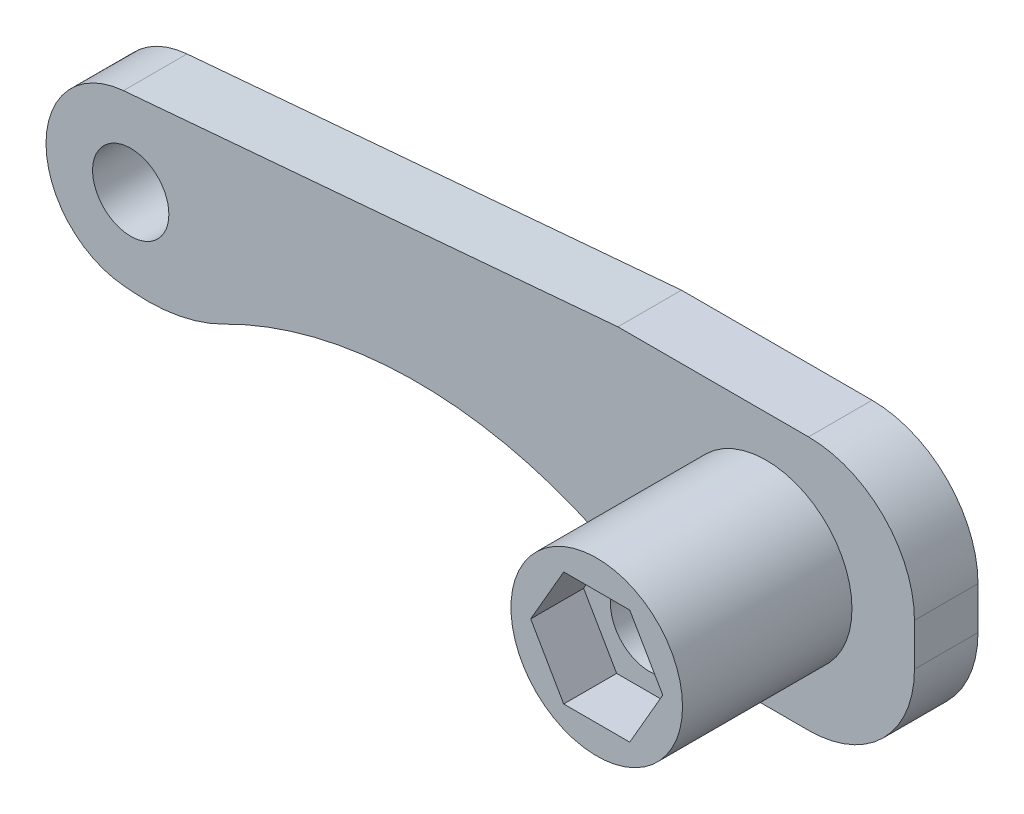
ISO-10303-21;
HEADER;
FILE_DESCRIPTION(('STEP AP214'),'2;1');
FILE_NAME('part.step','',(''),(''),'','','');
FILE_SCHEMA(('AUTOMOTIVE_DESIGN { 1 0 10303 214 1 1 1 1 }'));
ENDSEC;
DATA;
#1=APPLICATION_CONTEXT('core data for automotive mechanical design processes');
#2=APPLICATION_PROTOCOL_DEFINITION('international standard','automotive_design',2000,#1);
#3=PRODUCT_CONTEXT('',#1,'mechanical');
#4=PRODUCT('Part','Part','',(#3));
#5=PRODUCT_RELATED_PRODUCT_CATEGORY('part','',(#4));
#6=PRODUCT_DEFINITION_FORMATION('','',#4);
#7=PRODUCT_DEFINITION_CONTEXT('part definition',#1,'design');
#8=PRODUCT_DEFINITION('design','',#6,#7);
#9=PRODUCT_DEFINITION_SHAPE('','',#8);
#10=(LENGTH_UNIT() NAMED_UNIT(*) SI_UNIT(.MILLI.,.METRE.));
#11=(NAMED_UNIT(*) PLANE_ANGLE_UNIT() SI_UNIT($,.RADIAN.));
#12=(NAMED_UNIT(*) SI_UNIT($,.STERADIAN.) SOLID_ANGLE_UNIT());
#13=UNCERTAINTY_MEASURE_WITH_UNIT(LENGTH_MEASURE(1.E-05),#10,'distance_accuracy_value','');
#14=(GEOMETRIC_REPRESENTATION_CONTEXT(3) GLOBAL_UNCERTAINTY_ASSIGNED_CONTEXT((#13)) GLOBAL_UNIT_ASSIGNED_CONTEXT((#10,
#11,#12)) REPRESENTATION_CONTEXT('',''));
#15=CARTESIAN_POINT('',(0.,0.,0.));
#16=DIRECTION('',(0.,0.,1.));
#17=DIRECTION('',(1.,0.,0.));
#18=AXIS2_PLACEMENT_3D('',#15,#16,#17);
#19=CARTESIAN_POINT('',(0.,-6.,3.));
#20=DIRECTION('',(0.,1.,0.));
#21=DIRECTION('',(0.,0.,1.));
#22=AXIS2_PLACEMENT_3D('',#19,#20,#21);
#23=PLANE('',#22);
#24=DIRECTION('',(1.,0.,0.));
#25=VECTOR('',#24,1.);
#26=CARTESIAN_POINT('',(0.,-6.,3.));
#27=LINE('',#26,#25);
#28=CARTESIAN_POINT('',(-0.531280577328697,-6.,3.));
#29=VERTEX_POINT('',#28);
#30=CARTESIAN_POINT('',(2.,-6.,3.));
#31=VERTEX_POINT('',#30);
#32=EDGE_CURVE('E233',#29,#31,#27,.T.);
#33=ORIENTED_EDGE('',*,*,#32,.F.);
#34=DIRECTION('',(0.,0.,-1.));
#35=VECTOR('',#34,1.);
#36=CARTESIAN_POINT('',(-0.531280577328697,-6.,0.));
#37=LINE('',#36,#35);
#38=CARTESIAN_POINT('',(-0.531280577328697,-6.,0.));
#39=VERTEX_POINT('',#38);
#40=EDGE_CURVE('E62',#29,#39,#37,.T.);
#41=ORIENTED_EDGE('',*,*,#40,.T.);
#42=DIRECTION('',(1.,0.,0.));
#43=VECTOR('',#42,1.);
#44=CARTESIAN_POINT('',(0.,-6.,0.));
#45=LINE('',#44,#43);
#46=CARTESIAN_POINT('',(2.,-6.,0.));
#47=VERTEX_POINT('',#46);
#48=EDGE_CURVE('E229',#39,#47,#45,.T.);
#49=ORIENTED_EDGE('',*,*,#48,.T.);
#50=DIRECTION('',(0.,0.,-1.));
#51=VECTOR('',#50,1.);
#52=CARTESIAN_POINT('',(2.,-6.,3.));
#53=LINE('',#52,#51);
#54=EDGE_CURVE('E286',#47,#31,#53,.F.);
#55=ORIENTED_EDGE('',*,*,#54,.T.);
#56=EDGE_LOOP('',(#33,#41,#49,#55));
#57=FACE_BOUND('',#56,.T.);
#58=ADVANCED_FACE('F39',(#57),#23,.F.);
#59=CARTESIAN_POINT('',(-0.565790740129366,-6.55533627372847,3.));
#60=DIRECTION('',(-0.0859902551616277,-0.996295978119574,0.));
#61=DIRECTION('',(0.996295978119574,-0.0859902551616277,0.));
#62=AXIS2_PLACEMENT_3D('',#59,#60,#61);
#63=PLANE('',#62);
#64=DIRECTION('',(-0.996295978119574,0.0859902551616277,0.));
#65=VECTOR('',#64,1.);
#66=CARTESIAN_POINT('',(-0.565790740129366,-6.55533627372847,0.));
#67=LINE('',#66,#65);
#68=CARTESIAN_POINT('',(-29.901916014926,-4.02333679442265,0.));
#69=VERTEX_POINT('',#68);
#70=CARTESIAN_POINT('',(-30.3439610206465,-3.9851839124783,0.));
#71=VERTEX_POINT('',#70);
#72=EDGE_CURVE('E265',#69,#71,#67,.T.);
#73=ORIENTED_EDGE('',*,*,#72,.F.);
#74=DIRECTION('',(0.,0.,1.));
#75=VECTOR('',#74,1.);
#76=CARTESIAN_POINT('',(-29.901916014926,-4.02333679442265,3.));
#77=LINE('',#76,#75);
#78=CARTESIAN_POINT('',(-29.901916014926,-4.02333679442265,3.));
#79=VERTEX_POINT('',#78);
#80=EDGE_CURVE('E11',#69,#79,#77,.T.);
#81=ORIENTED_EDGE('',*,*,#80,.T.);
#82=DIRECTION('',(-0.996295978119574,0.0859902551616277,0.));
#83=VECTOR('',#82,1.);
#84=CARTESIAN_POINT('',(-0.565790740129366,-6.55533627372847,3.));
#85=LINE('',#84,#83);
#86=CARTESIAN_POINT('',(-30.3439610206465,-3.9851839124783,3.));
#87=VERTEX_POINT('',#86);
#88=EDGE_CURVE('E247',#79,#87,#85,.T.);
#89=ORIENTED_EDGE('',*,*,#88,.T.);
#90=DIRECTION('',(0.,0.,-1.));
#91=VECTOR('',#90,1.);
#92=CARTESIAN_POINT('',(-30.3439610206465,-3.9851839124783,3.));
#93=LINE('',#92,#91);
#94=EDGE_CURVE('E252',#87,#71,#93,.T.);
#95=ORIENTED_EDGE('',*,*,#94,.T.);
#96=EDGE_LOOP('',(#73,#81,#89,#95));
#97=FACE_BOUND('',#96,.T.);
#98=ADVANCED_FACE('F352',(#97),#63,.T.);
#99=CARTESIAN_POINT('',(0.,0.,3.));
#100=DIRECTION('',(0.,0.,1.));
#101=DIRECTION('',(1.,0.,0.));
#102=AXIS2_PLACEMENT_3D('',#99,#100,#101);
#103=PLANE('',#102);
#104=CARTESIAN_POINT('',(0.,0.,3.));
#105=DIRECTION('',(0.,0.,1.));
#106=DIRECTION('',(1.,0.,0.));
#107=AXIS2_PLACEMENT_3D('',#104,#105,#106);
#108=CIRCLE('',#107,4.05);
#109=CARTESIAN_POINT('',(4.05,0.,3.));
#110=VERTEX_POINT('',#109);
#111=EDGE_CURVE('E230',#110,#110,#108,.T.);
#112=ORIENTED_EDGE('',*,*,#111,.F.);
#113=EDGE_LOOP('',(#112));
#114=FACE_BOUND('',#113,.T.);
#115=CARTESIAN_POINT('',(-30.,0.,3.));
#116=DIRECTION('',(0.,0.,1.));
#117=DIRECTION('',(1.,0.,0.));
#118=AXIS2_PLACEMENT_3D('',#115,#116,#117);
#119=CIRCLE('',#118,1.8);
#120=CARTESIAN_POINT('',(-28.2,0.,3.));
#121=VERTEX_POINT('',#120);
#122=EDGE_CURVE('E249',#121,#121,#119,.T.);
#123=ORIENTED_EDGE('',*,*,#122,.F.);
#124=EDGE_LOOP('',(#123));
#125=FACE_BOUND('',#124,.T.);
#126=CARTESIAN_POINT('',(-16.5,-21.,3.));
#127=DIRECTION('',(0.,0.,1.));
#128=DIRECTION('',(1.,0.,0.));
#129=AXIS2_PLACEMENT_3D('',#126,#127,#128);
#130=CIRCLE('',#129,20.);
#131=CARTESIAN_POINT('',(-25.5814242668807,-3.18069212104719,3.));
#132=VERTEX_POINT('',#131);
#133=CARTESIAN_POINT('',(-5.09377184094907,-4.57142857142857,3.));
#134=VERTEX_POINT('',#133);
#135=EDGE_CURVE('E192',#132,#134,#130,.F.);
#136=ORIENTED_EDGE('',*,*,#135,.T.);
#137=CARTESIAN_POINT('',(-0.531280577328697,2.,3.));
#138=DIRECTION('',(0.,0.,1.));
#139=DIRECTION('',(1.,0.,0.));
#140=AXIS2_PLACEMENT_3D('',#137,#138,#139);
#141=CIRCLE('',#140,8.);
#142=EDGE_CURVE('E305',#134,#29,#141,.T.);
#143=ORIENTED_EDGE('',*,*,#142,.T.);
#144=ORIENTED_EDGE('',*,*,#32,.T.);
#145=CARTESIAN_POINT('',(2.,-0.999999999999999,3.));
#146=DIRECTION('',(0.,0.,1.));
#147=DIRECTION('',(1.,0.,0.));
#148=AXIS2_PLACEMENT_3D('',#145,#146,#147);
#149=CIRCLE('',#148,5.);
#150=CARTESIAN_POINT('',(7.,-0.999999999999999,3.));
#151=VERTEX_POINT('',#150);
#152=EDGE_CURVE('E291',#31,#151,#149,.T.);
#153=ORIENTED_EDGE('',*,*,#152,.T.);
#154=DIRECTION('',(0.,1.,0.));
#155=VECTOR('',#154,1.);
#156=CARTESIAN_POINT('',(7.,0.,3.));
#157=LINE('',#156,#155);
#158=CARTESIAN_POINT('',(7.,1.,3.));
#159=VERTEX_POINT('',#158);
#160=EDGE_CURVE('E236',#151,#159,#157,.T.);
#161=ORIENTED_EDGE('',*,*,#160,.T.);
#162=CARTESIAN_POINT('',(2.,1.,3.));
#163=DIRECTION('',(0.,0.,1.));
#164=DIRECTION('',(1.,0.,0.));
#165=AXIS2_PLACEMENT_3D('',#162,#163,#164);
#166=CIRCLE('',#165,5.);
#167=CARTESIAN_POINT('',(2.,6.,3.));
#168=VERTEX_POINT('',#167);
#169=EDGE_CURVE('E289',#159,#168,#166,.T.);
#170=ORIENTED_EDGE('',*,*,#169,.T.);
#171=DIRECTION('',(1.,0.,0.));
#172=VECTOR('',#171,1.);
#173=CARTESIAN_POINT('',(0.,6.,3.));
#174=LINE('',#173,#172);
#175=CARTESIAN_POINT('',(-7.,6.,3.));
#176=VERTEX_POINT('',#175);
#177=EDGE_CURVE('E239',#176,#168,#174,.T.);
#178=ORIENTED_EDGE('',*,*,#177,.F.);
#179=DIRECTION('',(-0.996295978119574,-0.0859902551616282,0.));
#180=VECTOR('',#179,1.);
#181=CARTESIAN_POINT('',(-0.56579074012937,6.55533627372847,3.));
#182=LINE('',#181,#180);
#183=CARTESIAN_POINT('',(-30.3439610206465,3.98518391247829,3.));
#184=VERTEX_POINT('',#183);
#185=EDGE_CURVE('E242',#176,#184,#182,.T.);
#186=ORIENTED_EDGE('',*,*,#185,.T.);
#187=CARTESIAN_POINT('',(-30.,0.,3.));
#188=DIRECTION('',(0.,0.,1.));
#189=DIRECTION('',(1.,0.,0.));
#190=AXIS2_PLACEMENT_3D('',#187,#188,#189);
#191=CIRCLE('',#190,4.);
#192=EDGE_CURVE('E244',#184,#87,#191,.T.);
#193=ORIENTED_EDGE('',*,*,#192,.T.);
#194=ORIENTED_EDGE('',*,*,#88,.F.);
#195=CARTESIAN_POINT('',(-29.213993973633,3.94703103053393,3.));
#196=DIRECTION('',(0.,0.,1.));
#197=DIRECTION('',(1.,0.,0.));
#198=AXIS2_PLACEMENT_3D('',#195,#196,#197);
#199=CIRCLE('',#198,8.);
#200=EDGE_CURVE('E303',#79,#132,#199,.T.);
#201=ORIENTED_EDGE('',*,*,#200,.T.);
#202=EDGE_LOOP('',(#136,#143,#144,#153,#161,#170,#178,#186,#193,#194,#201));
#203=FACE_BOUND('',#202,.T.);
#204=ADVANCED_FACE('F321',(#114,#125,#203),#103,.T.);
#205=CARTESIAN_POINT('',(0.,0.,0.));
#206=DIRECTION('',(0.,0.,1.));
#207=DIRECTION('',(1.,0.,0.));
#208=AXIS2_PLACEMENT_3D('',#205,#206,#207);
#209=PLANE('',#208);
#210=CARTESIAN_POINT('',(-30.,0.,0.));
#211=DIRECTION('',(0.,0.,1.));
#212=DIRECTION('',(1.,0.,0.));
#213=AXIS2_PLACEMENT_3D('',#210,#211,#212);
#214=CIRCLE('',#213,1.8);
#215=CARTESIAN_POINT('',(-28.2,0.,0.));
#216=VERTEX_POINT('',#215);
#217=EDGE_CURVE('E234',#216,#216,#214,.T.);
#218=ORIENTED_EDGE('',*,*,#217,.T.);
#219=EDGE_LOOP('',(#218));
#220=FACE_BOUND('',#219,.T.);
#221=CARTESIAN_POINT('',(0.,0.,0.));
#222=DIRECTION('',(0.,0.,-1.));
#223=DIRECTION('',(-1.,0.,0.));
#224=AXIS2_PLACEMENT_3D('',#221,#222,#223);
#225=CIRCLE('',#224,1.85);
#226=CARTESIAN_POINT('',(-1.85,0.,0.));
#227=VERTEX_POINT('',#226);
#228=EDGE_CURVE('E223',#227,#227,#225,.T.);
#229=ORIENTED_EDGE('',*,*,#228,.F.);
#230=EDGE_LOOP('',(#229));
#231=FACE_BOUND('',#230,.T.);
#232=ORIENTED_EDGE('',*,*,#48,.F.);
#233=CARTESIAN_POINT('',(-0.531280577328697,2.,0.));
#234=DIRECTION('',(0.,0.,1.));
#235=DIRECTION('',(1.,0.,0.));
#236=AXIS2_PLACEMENT_3D('',#233,#234,#235);
#237=CIRCLE('',#236,8.);
#238=CARTESIAN_POINT('',(-5.09377184094907,-4.57142857142857,0.));
#239=VERTEX_POINT('',#238);
#240=EDGE_CURVE('E47',#39,#239,#237,.F.);
#241=ORIENTED_EDGE('',*,*,#240,.T.);
#242=CARTESIAN_POINT('',(-16.5,-21.,0.));
#243=DIRECTION('',(0.,0.,1.));
#244=DIRECTION('',(1.,0.,0.));
#245=AXIS2_PLACEMENT_3D('',#242,#243,#244);
#246=CIRCLE('',#245,20.);
#247=CARTESIAN_POINT('',(-25.5814242668807,-3.18069212104719,0.));
#248=VERTEX_POINT('',#247);
#249=EDGE_CURVE('E311',#248,#239,#246,.F.);
#250=ORIENTED_EDGE('',*,*,#249,.F.);
#251=CARTESIAN_POINT('',(-29.213993973633,3.94703103053393,0.));
#252=DIRECTION('',(0.,0.,1.));
#253=DIRECTION('',(1.,0.,0.));
#254=AXIS2_PLACEMENT_3D('',#251,#252,#253);
#255=CIRCLE('',#254,8.);
#256=EDGE_CURVE('E54',#248,#69,#255,.F.);
#257=ORIENTED_EDGE('',*,*,#256,.T.);
#258=ORIENTED_EDGE('',*,*,#72,.T.);
#259=CARTESIAN_POINT('',(-30.,0.,0.));
#260=DIRECTION('',(0.,0.,1.));
#261=DIRECTION('',(1.,0.,0.));
#262=AXIS2_PLACEMENT_3D('',#259,#260,#261);
#263=CIRCLE('',#262,4.);
#264=CARTESIAN_POINT('',(-30.3439610206465,3.98518391247829,0.));
#265=VERTEX_POINT('',#264);
#266=EDGE_CURVE('E262',#265,#71,#263,.T.);
#267=ORIENTED_EDGE('',*,*,#266,.F.);
#268=DIRECTION('',(-0.996295978119574,-0.0859902551616282,0.));
#269=VECTOR('',#268,1.);
#270=CARTESIAN_POINT('',(-0.56579074012937,6.55533627372847,0.));
#271=LINE('',#270,#269);
#272=CARTESIAN_POINT('',(-7.,6.,0.));
#273=VERTEX_POINT('',#272);
#274=EDGE_CURVE('E260',#273,#265,#271,.T.);
#275=ORIENTED_EDGE('',*,*,#274,.F.);
#276=DIRECTION('',(1.,0.,0.));
#277=VECTOR('',#276,1.);
#278=CARTESIAN_POINT('',(0.,6.,0.));
#279=LINE('',#278,#277);
#280=CARTESIAN_POINT('',(2.,6.,0.));
#281=VERTEX_POINT('',#280);
#282=EDGE_CURVE('E257',#273,#281,#279,.T.);
#283=ORIENTED_EDGE('',*,*,#282,.T.);
#284=CARTESIAN_POINT('',(2.,1.,0.));
#285=DIRECTION('',(0.,0.,1.));
#286=DIRECTION('',(1.,0.,0.));
#287=AXIS2_PLACEMENT_3D('',#284,#285,#286);
#288=CIRCLE('',#287,5.);
#289=CARTESIAN_POINT('',(7.,1.,0.));
#290=VERTEX_POINT('',#289);
#291=EDGE_CURVE('E281',#281,#290,#288,.F.);
#292=ORIENTED_EDGE('',*,*,#291,.T.);
#293=DIRECTION('',(0.,1.,0.));
#294=VECTOR('',#293,1.);
#295=CARTESIAN_POINT('',(7.,0.,0.));
#296=LINE('',#295,#294);
#297=CARTESIAN_POINT('',(7.,-0.999999999999999,0.));
#298=VERTEX_POINT('',#297);
#299=EDGE_CURVE('E254',#298,#290,#296,.T.);
#300=ORIENTED_EDGE('',*,*,#299,.F.);
#301=CARTESIAN_POINT('',(2.,-0.999999999999999,0.));
#302=DIRECTION('',(0.,0.,1.));
#303=DIRECTION('',(1.,0.,0.));
#304=AXIS2_PLACEMENT_3D('',#301,#302,#303);
#305=CIRCLE('',#304,5.);
#306=EDGE_CURVE('E283',#298,#47,#305,.F.);
#307=ORIENTED_EDGE('',*,*,#306,.T.);
#308=EDGE_LOOP('',(#232,#241,#250,#257,#258,#267,#275,#283,#292,#300,#307));
#309=FACE_BOUND('',#308,.T.);
#310=ADVANCED_FACE('F310',(#220,#231,#309),#209,.F.);
#311=CARTESIAN_POINT('',(0.,0.,11.));
#312=DIRECTION('',(0.,0.,-1.));
#313=DIRECTION('',(-1.,0.,0.));
#314=AXIS2_PLACEMENT_3D('',#311,#312,#313);
#315=CYLINDRICAL_SURFACE('',#314,1.85);
#316=ORIENTED_EDGE('',*,*,#228,.T.);
#317=EDGE_LOOP('',(#316));
#318=FACE_BOUND('',#317,.T.);
#319=CARTESIAN_POINT('',(0.,0.,8.5));
#320=DIRECTION('',(0.,0.,1.));
#321=DIRECTION('',(1.,0.,0.));
#322=AXIS2_PLACEMENT_3D('',#319,#320,#321);
#323=CIRCLE('',#322,1.85);
#324=CARTESIAN_POINT('',(1.85,0.,8.5));
#325=VERTEX_POINT('',#324);
#326=EDGE_CURVE('E215',#325,#325,#323,.F.);
#327=ORIENTED_EDGE('',*,*,#326,.F.);
#328=EDGE_LOOP('',(#327));
#329=FACE_BOUND('',#328,.T.);
#330=ADVANCED_FACE('F402',(#318,#329),#315,.F.);
#331=CARTESIAN_POINT('',(7.,0.,3.));
#332=DIRECTION('',(-1.,0.,0.));
#333=DIRECTION('',(0.,0.,1.));
#334=AXIS2_PLACEMENT_3D('',#331,#332,#333);
#335=PLANE('',#334);
#336=ORIENTED_EDGE('',*,*,#160,.F.);
#337=DIRECTION('',(0.,0.,-1.));
#338=VECTOR('',#337,1.);
#339=CARTESIAN_POINT('',(7.,-0.999999999999999,3.));
#340=LINE('',#339,#338);
#341=EDGE_CURVE('E278',#151,#298,#340,.T.);
#342=ORIENTED_EDGE('',*,*,#341,.T.);
#343=ORIENTED_EDGE('',*,*,#299,.T.);
#344=DIRECTION('',(0.,0.,-1.));
#345=VECTOR('',#344,1.);
#346=CARTESIAN_POINT('',(7.,1.,3.));
#347=LINE('',#346,#345);
#348=EDGE_CURVE('E276',#290,#159,#347,.F.);
#349=ORIENTED_EDGE('',*,*,#348,.T.);
#350=EDGE_LOOP('',(#336,#342,#343,#349));
#351=FACE_BOUND('',#350,.T.);
#352=ADVANCED_FACE('F330',(#351),#335,.F.);
#353=CARTESIAN_POINT('',(0.,6.,3.));
#354=DIRECTION('',(0.,1.,0.));
#355=DIRECTION('',(0.,0.,1.));
#356=AXIS2_PLACEMENT_3D('',#353,#354,#355);
#357=PLANE('',#356);
#358=ORIENTED_EDGE('',*,*,#177,.T.);
#359=DIRECTION('',(0.,0.,-1.));
#360=VECTOR('',#359,1.);
#361=CARTESIAN_POINT('',(2.,6.,0.));
#362=LINE('',#361,#360);
#363=EDGE_CURVE('E293',#168,#281,#362,.T.);
#364=ORIENTED_EDGE('',*,*,#363,.T.);
#365=ORIENTED_EDGE('',*,*,#282,.F.);
#366=DIRECTION('',(0.,0.,-1.));
#367=VECTOR('',#366,1.);
#368=CARTESIAN_POINT('',(-7.,6.,3.));
#369=LINE('',#368,#367);
#370=EDGE_CURVE('E274',#176,#273,#369,.T.);
#371=ORIENTED_EDGE('',*,*,#370,.F.);
#372=EDGE_LOOP('',(#358,#364,#365,#371));
#373=FACE_BOUND('',#372,.T.);
#374=ADVANCED_FACE('F338',(#373),#357,.T.);
#375=CARTESIAN_POINT('',(-0.56579074012937,6.55533627372847,3.));
#376=DIRECTION('',(0.0859902551616282,-0.996295978119574,0.));
#377=DIRECTION('',(0.996295978119574,0.0859902551616282,0.));
#378=AXIS2_PLACEMENT_3D('',#375,#376,#377);
#379=PLANE('',#378);
#380=ORIENTED_EDGE('',*,*,#274,.T.);
#381=DIRECTION('',(0.,0.,-1.));
#382=VECTOR('',#381,1.);
#383=CARTESIAN_POINT('',(-30.3439610206465,3.98518391247829,3.));
#384=LINE('',#383,#382);
#385=EDGE_CURVE('E271',#184,#265,#384,.T.);
#386=ORIENTED_EDGE('',*,*,#385,.F.);
#387=ORIENTED_EDGE('',*,*,#185,.F.);
#388=ORIENTED_EDGE('',*,*,#370,.T.);
#389=EDGE_LOOP('',(#380,#386,#387,#388));
#390=FACE_BOUND('',#389,.T.);
#391=ADVANCED_FACE('F344',(#390),#379,.F.);
#392=CARTESIAN_POINT('',(-30.,0.,3.));
#393=DIRECTION('',(0.,0.,-1.));
#394=DIRECTION('',(-1.,0.,0.));
#395=AXIS2_PLACEMENT_3D('',#392,#393,#394);
#396=CYLINDRICAL_SURFACE('',#395,4.);
#397=ORIENTED_EDGE('',*,*,#266,.T.);
#398=ORIENTED_EDGE('',*,*,#94,.F.);
#399=ORIENTED_EDGE('',*,*,#192,.F.);
#400=ORIENTED_EDGE('',*,*,#385,.T.);
#401=EDGE_LOOP('',(#397,#398,#399,#400));
#402=FACE_BOUND('',#401,.T.);
#403=ADVANCED_FACE('F349',(#402),#396,.T.);
#404=CARTESIAN_POINT('',(-30.,0.,3.));
#405=DIRECTION('',(0.,0.,-1.));
#406=DIRECTION('',(-1.,0.,0.));
#407=AXIS2_PLACEMENT_3D('',#404,#405,#406);
#408=CYLINDRICAL_SURFACE('',#407,1.8);
#409=ORIENTED_EDGE('',*,*,#122,.T.);
#410=EDGE_LOOP('',(#409));
#411=FACE_BOUND('',#410,.T.);
#412=ORIENTED_EDGE('',*,*,#217,.F.);
#413=EDGE_LOOP('',(#412));
#414=FACE_BOUND('',#413,.T.);
#415=ADVANCED_FACE('F410',(#411,#414),#408,.F.);
#416=CARTESIAN_POINT('',(0.,0.,11.));
#417=DIRECTION('',(0.,0.,-1.));
#418=DIRECTION('',(-1.,0.,0.));
#419=AXIS2_PLACEMENT_3D('',#416,#417,#418);
#420=CYLINDRICAL_SURFACE('',#419,4.05);
#421=ORIENTED_EDGE('',*,*,#111,.T.);
#422=EDGE_LOOP('',(#421));
#423=FACE_BOUND('',#422,.T.);
#424=CARTESIAN_POINT('',(0.,0.,11.));
#425=DIRECTION('',(0.,0.,1.));
#426=DIRECTION('',(1.,0.,0.));
#427=AXIS2_PLACEMENT_3D('',#424,#425,#426);
#428=CIRCLE('',#427,4.05);
#429=CARTESIAN_POINT('',(4.05,0.,11.));
#430=VERTEX_POINT('',#429);
#431=EDGE_CURVE('E226',#430,#430,#428,.T.);
#432=ORIENTED_EDGE('',*,*,#431,.F.);
#433=EDGE_LOOP('',(#432));
#434=FACE_BOUND('',#433,.T.);
#435=ADVANCED_FACE('F406',(#423,#434),#420,.T.);
#436=CARTESIAN_POINT('',(0.,0.,11.));
#437=DIRECTION('',(0.,0.,1.));
#438=DIRECTION('',(1.,0.,0.));
#439=AXIS2_PLACEMENT_3D('',#436,#437,#438);
#440=PLANE('',#439);
#441=DIRECTION('',(-0.5,0.866025403784439,0.));
#442=VECTOR('',#441,1.);
#443=CARTESIAN_POINT('',(3.11769145362398,0.,11.));
#444=LINE('',#443,#442);
#445=CARTESIAN_POINT('',(3.11769145362398,0.,11.));
#446=VERTEX_POINT('',#445);
#447=CARTESIAN_POINT('',(1.55884572681199,2.7,11.));
#448=VERTEX_POINT('',#447);
#449=EDGE_CURVE('E167',#446,#448,#444,.T.);
#450=ORIENTED_EDGE('',*,*,#449,.F.);
#451=DIRECTION('',(0.5,0.866025403784438,0.));
#452=VECTOR('',#451,1.);
#453=CARTESIAN_POINT('',(1.55884572681199,-2.7,11.));
#454=LINE('',#453,#452);
#455=CARTESIAN_POINT('',(1.55884572681199,-2.7,11.));
#456=VERTEX_POINT('',#455);
#457=EDGE_CURVE('E186',#456,#446,#454,.T.);
#458=ORIENTED_EDGE('',*,*,#457,.F.);
#459=DIRECTION('',(1.,0.,0.));
#460=VECTOR('',#459,1.);
#461=CARTESIAN_POINT('',(-1.55884572681199,-2.7,11.));
#462=LINE('',#461,#460);
#463=CARTESIAN_POINT('',(-1.55884572681199,-2.7,11.));
#464=VERTEX_POINT('',#463);
#465=EDGE_CURVE('E189',#464,#456,#462,.T.);
#466=ORIENTED_EDGE('',*,*,#465,.F.);
#467=DIRECTION('',(0.5,-0.866025403784439,0.));
#468=VECTOR('',#467,1.);
#469=CARTESIAN_POINT('',(-3.11769145362398,0.,11.));
#470=LINE('',#469,#468);
#471=CARTESIAN_POINT('',(-3.11769145362398,0.,11.));
#472=VERTEX_POINT('',#471);
#473=EDGE_CURVE('E208',#472,#464,#470,.T.);
#474=ORIENTED_EDGE('',*,*,#473,.F.);
#475=DIRECTION('',(-0.5,-0.866025403784439,0.));
#476=VECTOR('',#475,1.);
#477=CARTESIAN_POINT('',(-1.55884572681199,2.7,11.));
#478=LINE('',#477,#476);
#479=CARTESIAN_POINT('',(-1.55884572681199,2.7,11.));
#480=VERTEX_POINT('',#479);
#481=EDGE_CURVE('E205',#480,#472,#478,.T.);
#482=ORIENTED_EDGE('',*,*,#481,.F.);
#483=DIRECTION('',(-1.,0.,0.));
#484=VECTOR('',#483,1.);
#485=CARTESIAN_POINT('',(1.55884572681199,2.7,11.));
#486=LINE('',#485,#484);
#487=EDGE_CURVE('E203',#448,#480,#486,.T.);
#488=ORIENTED_EDGE('',*,*,#487,.F.);
#489=EDGE_LOOP('',(#450,#458,#466,#474,#482,#488));
#490=FACE_BOUND('',#489,.T.);
#491=ORIENTED_EDGE('',*,*,#431,.T.);
#492=EDGE_LOOP('',(#491));
#493=FACE_BOUND('',#492,.T.);
#494=ADVANCED_FACE('F371',(#490,#493),#440,.T.);
#495=CARTESIAN_POINT('',(2.,-0.999999999999999,3.));
#496=DIRECTION('',(0.,0.,-1.));
#497=DIRECTION('',(-1.,0.,0.));
#498=AXIS2_PLACEMENT_3D('',#495,#496,#497);
#499=CYLINDRICAL_SURFACE('',#498,5.);
#500=ORIENTED_EDGE('',*,*,#152,.F.);
#501=ORIENTED_EDGE('',*,*,#54,.F.);
#502=ORIENTED_EDGE('',*,*,#306,.F.);
#503=ORIENTED_EDGE('',*,*,#341,.F.);
#504=EDGE_LOOP('',(#500,#501,#502,#503));
#505=FACE_BOUND('',#504,.T.);
#506=ADVANCED_FACE('F326',(#505),#499,.T.);
#507=CARTESIAN_POINT('',(2.,1.,3.));
#508=DIRECTION('',(0.,0.,1.));
#509=DIRECTION('',(1.,0.,0.));
#510=AXIS2_PLACEMENT_3D('',#507,#508,#509);
#511=CYLINDRICAL_SURFACE('',#510,5.);
#512=ORIENTED_EDGE('',*,*,#169,.F.);
#513=ORIENTED_EDGE('',*,*,#348,.F.);
#514=ORIENTED_EDGE('',*,*,#291,.F.);
#515=ORIENTED_EDGE('',*,*,#363,.F.);
#516=EDGE_LOOP('',(#512,#513,#514,#515));
#517=FACE_BOUND('',#516,.T.);
#518=ADVANCED_FACE('F334',(#517),#511,.T.);
#519=CARTESIAN_POINT('',(0.,0.,8.5));
#520=DIRECTION('',(0.,0.,1.));
#521=DIRECTION('',(1.,0.,0.));
#522=AXIS2_PLACEMENT_3D('',#519,#520,#521);
#523=PLANE('',#522);
#524=DIRECTION('',(-0.5,0.866025403784439,0.));
#525=VECTOR('',#524,1.);
#526=CARTESIAN_POINT('',(3.11769145362398,0.,8.5));
#527=LINE('',#526,#525);
#528=CARTESIAN_POINT('',(3.11769145362398,0.,8.5));
#529=VERTEX_POINT('',#528);
#530=CARTESIAN_POINT('',(1.55884572681199,2.7,8.5));
#531=VERTEX_POINT('',#530);
#532=EDGE_CURVE('E164',#529,#531,#527,.T.);
#533=ORIENTED_EDGE('',*,*,#532,.T.);
#534=DIRECTION('',(-1.,0.,0.));
#535=VECTOR('',#534,1.);
#536=CARTESIAN_POINT('',(1.55884572681199,2.7,8.5));
#537=LINE('',#536,#535);
#538=CARTESIAN_POINT('',(-1.55884572681199,2.7,8.5));
#539=VERTEX_POINT('',#538);
#540=EDGE_CURVE('E175',#531,#539,#537,.T.);
#541=ORIENTED_EDGE('',*,*,#540,.T.);
#542=DIRECTION('',(-0.5,-0.866025403784439,0.));
#543=VECTOR('',#542,1.);
#544=CARTESIAN_POINT('',(-1.55884572681199,2.7,8.5));
#545=LINE('',#544,#543);
#546=CARTESIAN_POINT('',(-3.11769145362398,0.,8.5));
#547=VERTEX_POINT('',#546);
#548=EDGE_CURVE('E180',#539,#547,#545,.T.);
#549=ORIENTED_EDGE('',*,*,#548,.T.);
#550=DIRECTION('',(0.5,-0.866025403784439,0.));
#551=VECTOR('',#550,1.);
#552=CARTESIAN_POINT('',(-3.11769145362398,0.,8.5));
#553=LINE('',#552,#551);
#554=CARTESIAN_POINT('',(-1.55884572681199,-2.7,8.5));
#555=VERTEX_POINT('',#554);
#556=EDGE_CURVE('E196',#547,#555,#553,.T.);
#557=ORIENTED_EDGE('',*,*,#556,.T.);
#558=DIRECTION('',(1.,0.,0.));
#559=VECTOR('',#558,1.);
#560=CARTESIAN_POINT('',(-1.55884572681199,-2.7,8.5));
#561=LINE('',#560,#559);
#562=CARTESIAN_POINT('',(1.55884572681199,-2.7,8.5));
#563=VERTEX_POINT('',#562);
#564=EDGE_CURVE('E199',#555,#563,#561,.T.);
#565=ORIENTED_EDGE('',*,*,#564,.T.);
#566=DIRECTION('',(0.5,0.866025403784438,0.));
#567=VECTOR('',#566,1.);
#568=CARTESIAN_POINT('',(1.55884572681199,-2.7,8.5));
#569=LINE('',#568,#567);
#570=EDGE_CURVE('E172',#563,#529,#569,.T.);
#571=ORIENTED_EDGE('',*,*,#570,.T.);
#572=EDGE_LOOP('',(#533,#541,#549,#557,#565,#571));
#573=FACE_BOUND('',#572,.T.);
#574=ORIENTED_EDGE('',*,*,#326,.T.);
#575=EDGE_LOOP('',(#574));
#576=FACE_BOUND('',#575,.T.);
#577=ADVANCED_FACE('F182',(#573,#576),#523,.T.);
#578=CARTESIAN_POINT('',(3.11769145362398,0.,8.5));
#579=DIRECTION('',(0.866025403784438,0.5,0.));
#580=DIRECTION('',(-0.5,0.866025403784439,0.));
#581=AXIS2_PLACEMENT_3D('',#578,#579,#580);
#582=PLANE('',#581);
#583=ORIENTED_EDGE('',*,*,#449,.T.);
#584=DIRECTION('',(0.,0.,1.));
#585=VECTOR('',#584,1.);
#586=CARTESIAN_POINT('',(1.55884572681199,2.7,8.5));
#587=LINE('',#586,#585);
#588=EDGE_CURVE('E160',#531,#448,#587,.T.);
#589=ORIENTED_EDGE('',*,*,#588,.F.);
#590=ORIENTED_EDGE('',*,*,#532,.F.);
#591=DIRECTION('',(0.,0.,1.));
#592=VECTOR('',#591,1.);
#593=CARTESIAN_POINT('',(3.11769145362398,0.,8.5));
#594=LINE('',#593,#592);
#595=EDGE_CURVE('E213',#529,#446,#594,.T.);
#596=ORIENTED_EDGE('',*,*,#595,.T.);
#597=EDGE_LOOP('',(#583,#589,#590,#596));
#598=FACE_BOUND('',#597,.T.);
#599=ADVANCED_FACE('F162',(#598),#582,.F.);
#600=CARTESIAN_POINT('',(1.55884572681199,-2.7,8.5));
#601=DIRECTION('',(0.866025403784439,-0.5,0.));
#602=DIRECTION('',(0.5,0.866025403784439,0.));
#603=AXIS2_PLACEMENT_3D('',#600,#601,#602);
#604=PLANE('',#603);
#605=ORIENTED_EDGE('',*,*,#457,.T.);
#606=ORIENTED_EDGE('',*,*,#595,.F.);
#607=ORIENTED_EDGE('',*,*,#570,.F.);
#608=DIRECTION('',(0.,0.,1.));
#609=VECTOR('',#608,1.);
#610=CARTESIAN_POINT('',(1.55884572681199,-2.7,8.5));
#611=LINE('',#610,#609);
#612=EDGE_CURVE('E216',#563,#456,#611,.T.);
#613=ORIENTED_EDGE('',*,*,#612,.T.);
#614=EDGE_LOOP('',(#605,#606,#607,#613));
#615=FACE_BOUND('',#614,.T.);
#616=ADVANCED_FACE('F382',(#615),#604,.F.);
#617=CARTESIAN_POINT('',(-1.55884572681199,-2.7,8.5));
#618=DIRECTION('',(0.,-1.,0.));
#619=DIRECTION('',(0.,0.,-1.));
#620=AXIS2_PLACEMENT_3D('',#617,#618,#619);
#621=PLANE('',#620);
#622=ORIENTED_EDGE('',*,*,#465,.T.);
#623=ORIENTED_EDGE('',*,*,#612,.F.);
#624=ORIENTED_EDGE('',*,*,#564,.F.);
#625=DIRECTION('',(0.,0.,1.));
#626=VECTOR('',#625,1.);
#627=CARTESIAN_POINT('',(-1.55884572681199,-2.7,8.5));
#628=LINE('',#627,#626);
#629=EDGE_CURVE('E218',#555,#464,#628,.T.);
#630=ORIENTED_EDGE('',*,*,#629,.T.);
#631=EDGE_LOOP('',(#622,#623,#624,#630));
#632=FACE_BOUND('',#631,.T.);
#633=ADVANCED_FACE('F388',(#632),#621,.F.);
#634=CARTESIAN_POINT('',(-3.11769145362398,0.,8.5));
#635=DIRECTION('',(-0.866025403784439,-0.5,0.));
#636=DIRECTION('',(0.5,-0.866025403784439,0.));
#637=AXIS2_PLACEMENT_3D('',#634,#635,#636);
#638=PLANE('',#637);
#639=ORIENTED_EDGE('',*,*,#473,.T.);
#640=ORIENTED_EDGE('',*,*,#629,.F.);
#641=ORIENTED_EDGE('',*,*,#556,.F.);
#642=DIRECTION('',(0.,0.,1.));
#643=VECTOR('',#642,1.);
#644=CARTESIAN_POINT('',(-3.11769145362398,0.,8.5));
#645=LINE('',#644,#643);
#646=EDGE_CURVE('E220',#547,#472,#645,.T.);
#647=ORIENTED_EDGE('',*,*,#646,.T.);
#648=EDGE_LOOP('',(#639,#640,#641,#647));
#649=FACE_BOUND('',#648,.T.);
#650=ADVANCED_FACE('F392',(#649),#638,.F.);
#651=CARTESIAN_POINT('',(-1.55884572681199,2.7,8.5));
#652=DIRECTION('',(-0.866025403784438,0.5,0.));
#653=DIRECTION('',(-0.5,-0.866025403784439,0.));
#654=AXIS2_PLACEMENT_3D('',#651,#652,#653);
#655=PLANE('',#654);
#656=ORIENTED_EDGE('',*,*,#481,.T.);
#657=ORIENTED_EDGE('',*,*,#646,.F.);
#658=ORIENTED_EDGE('',*,*,#548,.F.);
#659=DIRECTION('',(0.,0.,1.));
#660=VECTOR('',#659,1.);
#661=CARTESIAN_POINT('',(-1.55884572681199,2.7,8.5));
#662=LINE('',#661,#660);
#663=EDGE_CURVE('E171',#539,#480,#662,.T.);
#664=ORIENTED_EDGE('',*,*,#663,.T.);
#665=EDGE_LOOP('',(#656,#657,#658,#664));
#666=FACE_BOUND('',#665,.T.);
#667=ADVANCED_FACE('F396',(#666),#655,.F.);
#668=CARTESIAN_POINT('',(1.55884572681199,2.7,8.5));
#669=DIRECTION('',(0.,1.,0.));
#670=DIRECTION('',(0.,0.,1.));
#671=AXIS2_PLACEMENT_3D('',#668,#669,#670);
#672=PLANE('',#671);
#673=ORIENTED_EDGE('',*,*,#487,.T.);
#674=ORIENTED_EDGE('',*,*,#663,.F.);
#675=ORIENTED_EDGE('',*,*,#540,.F.);
#676=ORIENTED_EDGE('',*,*,#588,.T.);
#677=EDGE_LOOP('',(#673,#674,#675,#676));
#678=FACE_BOUND('',#677,.T.);
#679=ADVANCED_FACE('F176',(#678),#672,.F.);
#680=CARTESIAN_POINT('',(-16.5,-21.,0.));
#681=DIRECTION('',(0.,0.,1.));
#682=DIRECTION('',(1.,0.,0.));
#683=AXIS2_PLACEMENT_3D('',#680,#681,#682);
#684=CYLINDRICAL_SURFACE('',#683,20.);
#685=ORIENTED_EDGE('',*,*,#249,.T.);
#686=DIRECTION('',(0.,0.,1.));
#687=VECTOR('',#686,1.);
#688=CARTESIAN_POINT('',(-5.09377184094907,-4.57142857142857,0.));
#689=LINE('',#688,#687);
#690=EDGE_CURVE('E300',#239,#134,#689,.T.);
#691=ORIENTED_EDGE('',*,*,#690,.T.);
#692=ORIENTED_EDGE('',*,*,#135,.F.);
#693=DIRECTION('',(0.,0.,1.));
#694=VECTOR('',#693,1.);
#695=CARTESIAN_POINT('',(-25.5814242668807,-3.18069212104719,0.));
#696=LINE('',#695,#694);
#697=EDGE_CURVE('E296',#132,#248,#696,.F.);
#698=ORIENTED_EDGE('',*,*,#697,.T.);
#699=EDGE_LOOP('',(#685,#691,#692,#698));
#700=FACE_BOUND('',#699,.T.);
#701=ADVANCED_FACE('F315',(#700),#684,.F.);
#702=CARTESIAN_POINT('',(-0.531280577328697,2.,0.));
#703=DIRECTION('',(0.,0.,1.));
#704=DIRECTION('',(1.,0.,0.));
#705=AXIS2_PLACEMENT_3D('',#702,#703,#704);
#706=CYLINDRICAL_SURFACE('',#705,8.);
#707=ORIENTED_EDGE('',*,*,#240,.F.);
#708=ORIENTED_EDGE('',*,*,#40,.F.);
#709=ORIENTED_EDGE('',*,*,#142,.F.);
#710=ORIENTED_EDGE('',*,*,#690,.F.);
#711=EDGE_LOOP('',(#707,#708,#709,#710));
#712=FACE_BOUND('',#711,.T.);
#713=ADVANCED_FACE('F319',(#712),#706,.T.);
#714=CARTESIAN_POINT('',(-29.213993973633,3.94703103053393,0.));
#715=DIRECTION('',(0.,0.,1.));
#716=DIRECTION('',(1.,0.,0.));
#717=AXIS2_PLACEMENT_3D('',#714,#715,#716);
#718=CYLINDRICAL_SURFACE('',#717,8.);
#719=ORIENTED_EDGE('',*,*,#256,.F.);
#720=ORIENTED_EDGE('',*,*,#697,.F.);
#721=ORIENTED_EDGE('',*,*,#200,.F.);
#722=ORIENTED_EDGE('',*,*,#80,.F.);
#723=EDGE_LOOP('',(#719,#720,#721,#722));
#724=FACE_BOUND('',#723,.T.);
#725=ADVANCED_FACE('F41',(#724),#718,.T.);
#726=CLOSED_SHELL('',(#58,#98,#204,#310,#330,#352,#374,#391,#403,#415,#435,#494,#506,#518,#577,
#599,#616,#633,#650,#667,#679,#701,#713,#725));
#727=MANIFOLD_SOLID_BREP('B2',#726);
#728=ADVANCED_BREP_SHAPE_REPRESENTATION('',(#18,#727),#14);
#729=SHAPE_DEFINITION_REPRESENTATION(#9,#728);
ENDSEC;
END-ISO-10303-21;
